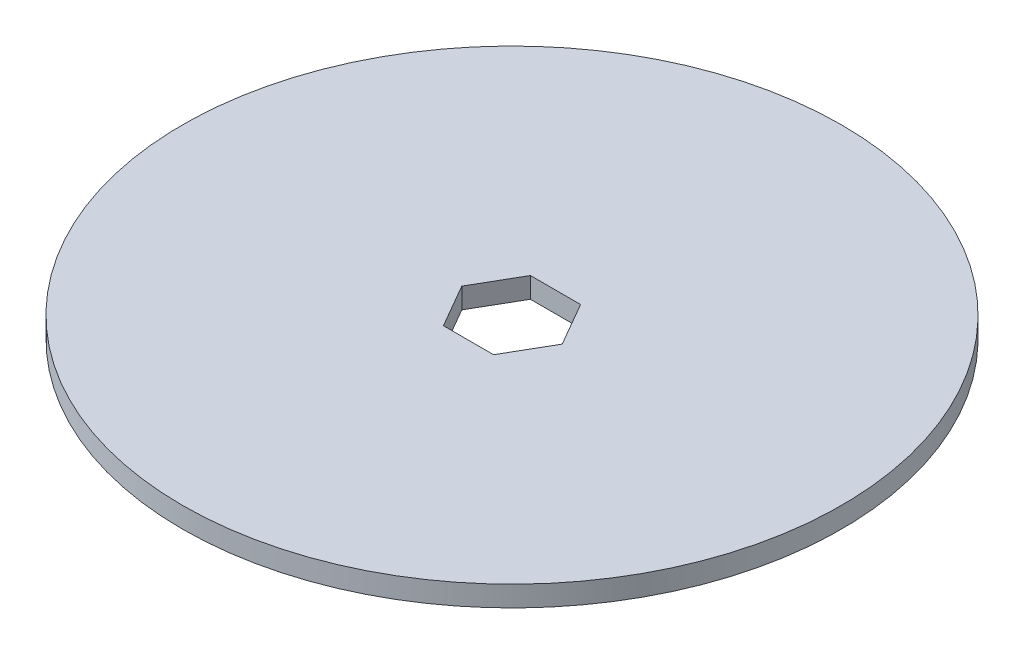
ISO-10303-21;
HEADER;
FILE_DESCRIPTION(('STEP AP214'),'2;1');
FILE_NAME('part.step','',(''),(''),'','','');
FILE_SCHEMA(('AUTOMOTIVE_DESIGN { 1 0 10303 214 1 1 1 1 }'));
ENDSEC;
DATA;
#1=APPLICATION_CONTEXT('core data for automotive mechanical design processes');
#2=APPLICATION_PROTOCOL_DEFINITION('international standard','automotive_design',2000,#1);
#3=PRODUCT_CONTEXT('',#1,'mechanical');
#4=PRODUCT('Part','Part','',(#3));
#5=PRODUCT_RELATED_PRODUCT_CATEGORY('part','',(#4));
#6=PRODUCT_DEFINITION_FORMATION('','',#4);
#7=PRODUCT_DEFINITION_CONTEXT('part definition',#1,'design');
#8=PRODUCT_DEFINITION('design','',#6,#7);
#9=PRODUCT_DEFINITION_SHAPE('','',#8);
#10=(LENGTH_UNIT() NAMED_UNIT(*) SI_UNIT(.MILLI.,.METRE.));
#11=(NAMED_UNIT(*) PLANE_ANGLE_UNIT() SI_UNIT($,.RADIAN.));
#12=(NAMED_UNIT(*) SI_UNIT($,.STERADIAN.) SOLID_ANGLE_UNIT());
#13=UNCERTAINTY_MEASURE_WITH_UNIT(LENGTH_MEASURE(1.E-05),#10,'distance_accuracy_value','');
#14=(GEOMETRIC_REPRESENTATION_CONTEXT(3) GLOBAL_UNCERTAINTY_ASSIGNED_CONTEXT((#13)) GLOBAL_UNIT_ASSIGNED_CONTEXT((#10,
#11,#12)) REPRESENTATION_CONTEXT('',''));
#15=CARTESIAN_POINT('',(0.,0.,0.));
#16=DIRECTION('',(0.,0.,1.));
#17=DIRECTION('',(1.,0.,0.));
#18=AXIS2_PLACEMENT_3D('',#15,#16,#17);
#19=CARTESIAN_POINT('',(2.9025,1.5875,1.67575915632289));
#20=DIRECTION('',(-0.866025403784439,0.,-0.5));
#21=DIRECTION('',(-0.5,0.,0.866025403784439));
#22=AXIS2_PLACEMENT_3D('',#19,#20,#21);
#23=PLANE('',#22);
#24=DIRECTION('',(0.5,0.,-0.866025403784439));
#25=VECTOR('',#24,1.);
#26=CARTESIAN_POINT('',(2.9025,0.,1.67575915632289));
#27=LINE('',#26,#25);
#28=CARTESIAN_POINT('',(1.935,0.,3.35151831264578));
#29=VERTEX_POINT('',#28);
#30=CARTESIAN_POINT('',(3.87,0.,0.));
#31=VERTEX_POINT('',#30);
#32=EDGE_CURVE('E138',#29,#31,#27,.T.);
#33=ORIENTED_EDGE('',*,*,#32,.F.);
#34=DIRECTION('',(0.,-1.,0.));
#35=VECTOR('',#34,1.);
#36=CARTESIAN_POINT('',(1.935,1.5875,3.35151831264578));
#37=LINE('',#36,#35);
#38=CARTESIAN_POINT('',(1.935,1.5875,3.35151831264578));
#39=VERTEX_POINT('',#38);
#40=EDGE_CURVE('E11',#39,#29,#37,.T.);
#41=ORIENTED_EDGE('',*,*,#40,.F.);
#42=DIRECTION('',(0.5,0.,-0.866025403784439));
#43=VECTOR('',#42,1.);
#44=CARTESIAN_POINT('',(2.9025,1.5875,1.67575915632289));
#45=LINE('',#44,#43);
#46=CARTESIAN_POINT('',(3.87,1.5875,0.));
#47=VERTEX_POINT('',#46);
#48=EDGE_CURVE('E162',#39,#47,#45,.T.);
#49=ORIENTED_EDGE('',*,*,#48,.T.);
#50=DIRECTION('',(0.,-1.,0.));
#51=VECTOR('',#50,1.);
#52=CARTESIAN_POINT('',(3.87,1.5875,0.));
#53=LINE('',#52,#51);
#54=EDGE_CURVE('E64',#47,#31,#53,.T.);
#55=ORIENTED_EDGE('',*,*,#54,.T.);
#56=EDGE_LOOP('',(#33,#41,#49,#55));
#57=FACE_BOUND('',#56,.T.);
#58=ADVANCED_FACE('F47',(#57),#23,.T.);
#59=CARTESIAN_POINT('',(0.,1.5875,3.35151831264578));
#60=DIRECTION('',(0.,0.,-1.));
#61=DIRECTION('',(-1.,0.,0.));
#62=AXIS2_PLACEMENT_3D('',#59,#60,#61);
#63=PLANE('',#62);
#64=DIRECTION('',(1.,0.,0.));
#65=VECTOR('',#64,1.);
#66=CARTESIAN_POINT('',(0.,0.,3.35151831264578));
#67=LINE('',#66,#65);
#68=CARTESIAN_POINT('',(-1.935,0.,3.35151831264578));
#69=VERTEX_POINT('',#68);
#70=EDGE_CURVE('E141',#69,#29,#67,.T.);
#71=ORIENTED_EDGE('',*,*,#70,.F.);
#72=DIRECTION('',(0.,-1.,0.));
#73=VECTOR('',#72,1.);
#74=CARTESIAN_POINT('',(-1.935,1.5875,3.35151831264578));
#75=LINE('',#74,#73);
#76=CARTESIAN_POINT('',(-1.935,1.5875,3.35151831264578));
#77=VERTEX_POINT('',#76);
#78=EDGE_CURVE('E56',#77,#69,#75,.T.);
#79=ORIENTED_EDGE('',*,*,#78,.F.);
#80=DIRECTION('',(1.,0.,0.));
#81=VECTOR('',#80,1.);
#82=CARTESIAN_POINT('',(0.,1.5875,3.35151831264578));
#83=LINE('',#82,#81);
#84=EDGE_CURVE('E255',#77,#39,#83,.T.);
#85=ORIENTED_EDGE('',*,*,#84,.T.);
#86=ORIENTED_EDGE('',*,*,#40,.T.);
#87=EDGE_LOOP('',(#71,#79,#85,#86));
#88=FACE_BOUND('',#87,.T.);
#89=ADVANCED_FACE('F175',(#88),#63,.T.);
#90=CARTESIAN_POINT('',(-2.9025,1.5875,1.67575915632289));
#91=DIRECTION('',(0.866025403784439,0.,-0.5));
#92=DIRECTION('',(-0.5,0.,-0.866025403784439));
#93=AXIS2_PLACEMENT_3D('',#90,#91,#92);
#94=PLANE('',#93);
#95=DIRECTION('',(0.5,0.,0.866025403784439));
#96=VECTOR('',#95,1.);
#97=CARTESIAN_POINT('',(-2.9025,0.,1.67575915632289));
#98=LINE('',#97,#96);
#99=CARTESIAN_POINT('',(-3.87,0.,0.));
#100=VERTEX_POINT('',#99);
#101=EDGE_CURVE('E145',#100,#69,#98,.T.);
#102=ORIENTED_EDGE('',*,*,#101,.F.);
#103=DIRECTION('',(0.,-1.,0.));
#104=VECTOR('',#103,1.);
#105=CARTESIAN_POINT('',(-3.87,1.5875,0.));
#106=LINE('',#105,#104);
#107=CARTESIAN_POINT('',(-3.87,1.5875,0.));
#108=VERTEX_POINT('',#107);
#109=EDGE_CURVE('E112',#108,#100,#106,.T.);
#110=ORIENTED_EDGE('',*,*,#109,.F.);
#111=DIRECTION('',(0.5,0.,0.866025403784439));
#112=VECTOR('',#111,1.);
#113=CARTESIAN_POINT('',(-2.9025,1.5875,1.67575915632289));
#114=LINE('',#113,#112);
#115=EDGE_CURVE('E123',#108,#77,#114,.T.);
#116=ORIENTED_EDGE('',*,*,#115,.T.);
#117=ORIENTED_EDGE('',*,*,#78,.T.);
#118=EDGE_LOOP('',(#102,#110,#116,#117));
#119=FACE_BOUND('',#118,.T.);
#120=ADVANCED_FACE('F172',(#119),#94,.T.);
#121=CARTESIAN_POINT('',(-2.9025,1.5875,-1.67575915632289));
#122=DIRECTION('',(0.866025403784439,0.,0.5));
#123=DIRECTION('',(0.5,0.,-0.866025403784439));
#124=AXIS2_PLACEMENT_3D('',#121,#122,#123);
#125=PLANE('',#124);
#126=DIRECTION('',(-0.5,0.,0.866025403784439));
#127=VECTOR('',#126,1.);
#128=CARTESIAN_POINT('',(-2.9025,0.,-1.67575915632289));
#129=LINE('',#128,#127);
#130=CARTESIAN_POINT('',(-1.935,0.,-3.35151831264578));
#131=VERTEX_POINT('',#130);
#132=EDGE_CURVE('E107',#131,#100,#129,.T.);
#133=ORIENTED_EDGE('',*,*,#132,.F.);
#134=DIRECTION('',(0.,-1.,0.));
#135=VECTOR('',#134,1.);
#136=CARTESIAN_POINT('',(-1.935,1.5875,-3.35151831264578));
#137=LINE('',#136,#135);
#138=CARTESIAN_POINT('',(-1.935,1.5875,-3.35151831264578));
#139=VERTEX_POINT('',#138);
#140=EDGE_CURVE('E102',#139,#131,#137,.T.);
#141=ORIENTED_EDGE('',*,*,#140,.F.);
#142=DIRECTION('',(-0.5,0.,0.866025403784439));
#143=VECTOR('',#142,1.);
#144=CARTESIAN_POINT('',(-2.9025,1.5875,-1.67575915632289));
#145=LINE('',#144,#143);
#146=EDGE_CURVE('E105',#139,#108,#145,.T.);
#147=ORIENTED_EDGE('',*,*,#146,.T.);
#148=ORIENTED_EDGE('',*,*,#109,.T.);
#149=EDGE_LOOP('',(#133,#141,#147,#148));
#150=FACE_BOUND('',#149,.T.);
#151=ADVANCED_FACE('F104',(#150),#125,.T.);
#152=CARTESIAN_POINT('',(0.,1.5875,-3.35151831264578));
#153=DIRECTION('',(0.,0.,1.));
#154=DIRECTION('',(1.,0.,0.));
#155=AXIS2_PLACEMENT_3D('',#152,#153,#154);
#156=PLANE('',#155);
#157=DIRECTION('',(-1.,0.,0.));
#158=VECTOR('',#157,1.);
#159=CARTESIAN_POINT('',(0.,0.,-3.35151831264578));
#160=LINE('',#159,#158);
#161=CARTESIAN_POINT('',(1.935,0.,-3.35151831264578));
#162=VERTEX_POINT('',#161);
#163=EDGE_CURVE('E151',#162,#131,#160,.T.);
#164=ORIENTED_EDGE('',*,*,#163,.F.);
#165=DIRECTION('',(0.,-1.,0.));
#166=VECTOR('',#165,1.);
#167=CARTESIAN_POINT('',(1.935,1.5875,-3.35151831264578));
#168=LINE('',#167,#166);
#169=CARTESIAN_POINT('',(1.935,1.5875,-3.35151831264578));
#170=VERTEX_POINT('',#169);
#171=EDGE_CURVE('E83',#170,#162,#168,.T.);
#172=ORIENTED_EDGE('',*,*,#171,.F.);
#173=DIRECTION('',(-1.,0.,0.));
#174=VECTOR('',#173,1.);
#175=CARTESIAN_POINT('',(0.,1.5875,-3.35151831264578));
#176=LINE('',#175,#174);
#177=EDGE_CURVE('E120',#170,#139,#176,.T.);
#178=ORIENTED_EDGE('',*,*,#177,.T.);
#179=ORIENTED_EDGE('',*,*,#140,.T.);
#180=EDGE_LOOP('',(#164,#172,#178,#179));
#181=FACE_BOUND('',#180,.T.);
#182=ADVANCED_FACE('F126',(#181),#156,.T.);
#183=CARTESIAN_POINT('',(2.9025,1.5875,-1.67575915632289));
#184=DIRECTION('',(-0.866025403784439,0.,0.5));
#185=DIRECTION('',(0.5,0.,0.866025403784439));
#186=AXIS2_PLACEMENT_3D('',#183,#184,#185);
#187=PLANE('',#186);
#188=DIRECTION('',(-0.5,0.,-0.866025403784439));
#189=VECTOR('',#188,1.);
#190=CARTESIAN_POINT('',(2.9025,0.,-1.67575915632289));
#191=LINE('',#190,#189);
#192=EDGE_CURVE('E154',#31,#162,#191,.T.);
#193=ORIENTED_EDGE('',*,*,#192,.F.);
#194=ORIENTED_EDGE('',*,*,#54,.F.);
#195=DIRECTION('',(-0.5,0.,-0.866025403784439));
#196=VECTOR('',#195,1.);
#197=CARTESIAN_POINT('',(2.9025,1.5875,-1.67575915632289));
#198=LINE('',#197,#196);
#199=EDGE_CURVE('E128',#47,#170,#198,.T.);
#200=ORIENTED_EDGE('',*,*,#199,.T.);
#201=ORIENTED_EDGE('',*,*,#171,.T.);
#202=EDGE_LOOP('',(#193,#194,#200,#201));
#203=FACE_BOUND('',#202,.T.);
#204=ADVANCED_FACE('F179',(#203),#187,.T.);
#205=CARTESIAN_POINT('',(0.,1.5875,0.));
#206=DIRECTION('',(0.,-1.,0.));
#207=DIRECTION('',(0.,0.,-1.));
#208=AXIS2_PLACEMENT_3D('',#205,#206,#207);
#209=CYLINDRICAL_SURFACE('',#208,25.4);
#210=CARTESIAN_POINT('',(0.,1.5875,0.));
#211=DIRECTION('',(0.,1.,0.));
#212=DIRECTION('',(0.,0.,1.));
#213=AXIS2_PLACEMENT_3D('',#210,#211,#212);
#214=CIRCLE('',#213,25.4);
#215=CARTESIAN_POINT('',(0.,1.5875,25.4));
#216=VERTEX_POINT('',#215);
#217=EDGE_CURVE('E131',#216,#216,#214,.T.);
#218=ORIENTED_EDGE('',*,*,#217,.F.);
#219=EDGE_LOOP('',(#218));
#220=FACE_BOUND('',#219,.T.);
#221=CARTESIAN_POINT('',(0.,0.,0.));
#222=DIRECTION('',(0.,1.,0.));
#223=DIRECTION('',(0.,0.,1.));
#224=AXIS2_PLACEMENT_3D('',#221,#222,#223);
#225=CIRCLE('',#224,25.4);
#226=CARTESIAN_POINT('',(0.,0.,25.4));
#227=VERTEX_POINT('',#226);
#228=EDGE_CURVE('E158',#227,#227,#225,.T.);
#229=ORIENTED_EDGE('',*,*,#228,.T.);
#230=EDGE_LOOP('',(#229));
#231=FACE_BOUND('',#230,.T.);
#232=ADVANCED_FACE('F181',(#220,#231),#209,.T.);
#233=CARTESIAN_POINT('',(0.,1.5875,0.));
#234=DIRECTION('',(0.,1.,0.));
#235=DIRECTION('',(0.,0.,1.));
#236=AXIS2_PLACEMENT_3D('',#233,#234,#235);
#237=PLANE('',#236);
#238=ORIENTED_EDGE('',*,*,#48,.F.);
#239=ORIENTED_EDGE('',*,*,#84,.F.);
#240=ORIENTED_EDGE('',*,*,#115,.F.);
#241=ORIENTED_EDGE('',*,*,#146,.F.);
#242=ORIENTED_EDGE('',*,*,#177,.F.);
#243=ORIENTED_EDGE('',*,*,#199,.F.);
#244=EDGE_LOOP('',(#238,#239,#240,#241,#242,#243));
#245=FACE_BOUND('',#244,.T.);
#246=ORIENTED_EDGE('',*,*,#217,.T.);
#247=EDGE_LOOP('',(#246));
#248=FACE_BOUND('',#247,.T.);
#249=ADVANCED_FACE('F117',(#245,#248),#237,.T.);
#250=CARTESIAN_POINT('',(0.,0.,0.));
#251=DIRECTION('',(0.,1.,0.));
#252=DIRECTION('',(0.,0.,1.));
#253=AXIS2_PLACEMENT_3D('',#250,#251,#252);
#254=PLANE('',#253);
#255=ORIENTED_EDGE('',*,*,#32,.T.);
#256=ORIENTED_EDGE('',*,*,#192,.T.);
#257=ORIENTED_EDGE('',*,*,#163,.T.);
#258=ORIENTED_EDGE('',*,*,#132,.T.);
#259=ORIENTED_EDGE('',*,*,#101,.T.);
#260=ORIENTED_EDGE('',*,*,#70,.T.);
#261=EDGE_LOOP('',(#255,#256,#257,#258,#259,#260));
#262=FACE_BOUND('',#261,.T.);
#263=ORIENTED_EDGE('',*,*,#228,.F.);
#264=EDGE_LOOP('',(#263));
#265=FACE_BOUND('',#264,.T.);
#266=ADVANCED_FACE('F177',(#262,#265),#254,.F.);
#267=CLOSED_SHELL('',(#58,#89,#120,#151,#182,#204,#232,#249,#266));
#268=MANIFOLD_SOLID_BREP('B2',#267);
#269=ADVANCED_BREP_SHAPE_REPRESENTATION('',(#18,#268),#14);
#270=SHAPE_DEFINITION_REPRESENTATION(#9,#269);
ENDSEC;
END-ISO-10303-21;
